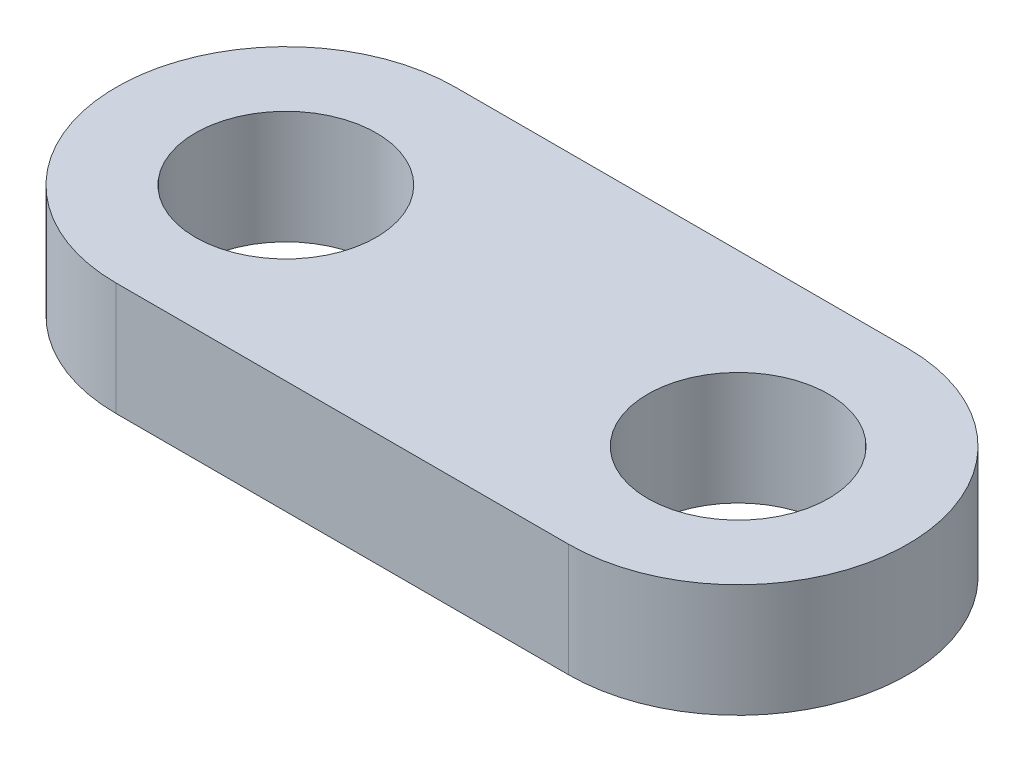
ISO-10303-21;
HEADER;
FILE_DESCRIPTION(('STEP AP214'),'2;1');
FILE_NAME('part.step','',(''),(''),'','','');
FILE_SCHEMA(('AUTOMOTIVE_DESIGN { 1 0 10303 214 1 1 1 1 }'));
ENDSEC;
DATA;
#1=APPLICATION_CONTEXT('core data for automotive mechanical design processes');
#2=APPLICATION_PROTOCOL_DEFINITION('international standard','automotive_design',2000,#1);
#3=PRODUCT_CONTEXT('',#1,'mechanical');
#4=PRODUCT('Part','Part','',(#3));
#5=PRODUCT_RELATED_PRODUCT_CATEGORY('part','',(#4));
#6=PRODUCT_DEFINITION_FORMATION('','',#4);
#7=PRODUCT_DEFINITION_CONTEXT('part definition',#1,'design');
#8=PRODUCT_DEFINITION('design','',#6,#7);
#9=PRODUCT_DEFINITION_SHAPE('','',#8);
#10=(LENGTH_UNIT() NAMED_UNIT(*) SI_UNIT(.MILLI.,.METRE.));
#11=(NAMED_UNIT(*) PLANE_ANGLE_UNIT() SI_UNIT($,.RADIAN.));
#12=(NAMED_UNIT(*) SI_UNIT($,.STERADIAN.) SOLID_ANGLE_UNIT());
#13=UNCERTAINTY_MEASURE_WITH_UNIT(LENGTH_MEASURE(1.E-05),#10,'distance_accuracy_value','');
#14=(GEOMETRIC_REPRESENTATION_CONTEXT(3) GLOBAL_UNCERTAINTY_ASSIGNED_CONTEXT((#13)) GLOBAL_UNIT_ASSIGNED_CONTEXT((#10,
#11,#12)) REPRESENTATION_CONTEXT('',''));
#15=CARTESIAN_POINT('',(0.,0.,0.));
#16=DIRECTION('',(0.,0.,1.));
#17=DIRECTION('',(1.,0.,0.));
#18=AXIS2_PLACEMENT_3D('',#15,#16,#17);
#19=CARTESIAN_POINT('',(10.,5.,0.));
#20=DIRECTION('',(0.,-1.,0.));
#21=DIRECTION('',(0.,0.,-1.));
#22=AXIS2_PLACEMENT_3D('',#19,#20,#21);
#23=PLANE('',#22);
#24=CARTESIAN_POINT('',(10.,5.,0.));
#25=DIRECTION('',(0.,1.,0.));
#26=DIRECTION('',(0.,0.,-1.));
#27=AXIS2_PLACEMENT_3D('',#24,#25,#26);
#28=CIRCLE('',#27,7.5);
#29=CARTESIAN_POINT('',(10.,5.,7.5));
#30=VERTEX_POINT('',#29);
#31=CARTESIAN_POINT('',(10.,5.,-7.5));
#32=VERTEX_POINT('',#31);
#33=EDGE_CURVE('E84',#30,#32,#28,.T.);
#34=ORIENTED_EDGE('',*,*,#33,.T.);
#35=DIRECTION('',(-1.,0.,0.));
#36=VECTOR('',#35,1.);
#37=CARTESIAN_POINT('',(-10.,5.,-7.5));
#38=LINE('',#37,#36);
#39=CARTESIAN_POINT('',(-10.,5.,-7.5));
#40=VERTEX_POINT('',#39);
#41=EDGE_CURVE('E79',#32,#40,#38,.T.);
#42=ORIENTED_EDGE('',*,*,#41,.T.);
#43=CARTESIAN_POINT('',(-10.,5.,0.));
#44=DIRECTION('',(0.,1.,0.));
#45=DIRECTION('',(0.,0.,1.));
#46=AXIS2_PLACEMENT_3D('',#43,#44,#45);
#47=CIRCLE('',#46,7.5);
#48=CARTESIAN_POINT('',(-10.,5.,7.5));
#49=VERTEX_POINT('',#48);
#50=EDGE_CURVE('E82',#40,#49,#47,.T.);
#51=ORIENTED_EDGE('',*,*,#50,.T.);
#52=DIRECTION('',(1.,0.,0.));
#53=VECTOR('',#52,1.);
#54=CARTESIAN_POINT('',(-10.,5.,7.5));
#55=LINE('',#54,#53);
#56=EDGE_CURVE('E49',#49,#30,#55,.T.);
#57=ORIENTED_EDGE('',*,*,#56,.T.);
#58=EDGE_LOOP('',(#34,#42,#51,#57));
#59=FACE_BOUND('',#58,.T.);
#60=CARTESIAN_POINT('',(-10.,5.,0.));
#61=DIRECTION('',(0.,1.,0.));
#62=DIRECTION('',(0.,0.,1.));
#63=AXIS2_PLACEMENT_3D('',#60,#61,#62);
#64=CIRCLE('',#63,4.);
#65=CARTESIAN_POINT('',(-10.,5.,4.));
#66=VERTEX_POINT('',#65);
#67=EDGE_CURVE('E99',#66,#66,#64,.T.);
#68=ORIENTED_EDGE('',*,*,#67,.F.);
#69=EDGE_LOOP('',(#68));
#70=FACE_BOUND('',#69,.T.);
#71=CARTESIAN_POINT('',(10.,5.,0.));
#72=DIRECTION('',(0.,1.,0.));
#73=DIRECTION('',(0.,0.,1.));
#74=AXIS2_PLACEMENT_3D('',#71,#72,#73);
#75=CIRCLE('',#74,4.);
#76=CARTESIAN_POINT('',(10.,5.,4.));
#77=VERTEX_POINT('',#76);
#78=EDGE_CURVE('E114',#77,#77,#75,.T.);
#79=ORIENTED_EDGE('',*,*,#78,.F.);
#80=EDGE_LOOP('',(#79));
#81=FACE_BOUND('',#80,.T.);
#82=ADVANCED_FACE('F32',(#59,#70,#81),#23,.F.);
#83=CARTESIAN_POINT('',(10.,0.,0.));
#84=DIRECTION('',(0.,-1.,0.));
#85=DIRECTION('',(0.,0.,-1.));
#86=AXIS2_PLACEMENT_3D('',#83,#84,#85);
#87=PLANE('',#86);
#88=CARTESIAN_POINT('',(-10.,0.,0.));
#89=DIRECTION('',(0.,1.,0.));
#90=DIRECTION('',(0.,0.,1.));
#91=AXIS2_PLACEMENT_3D('',#88,#89,#90);
#92=CIRCLE('',#91,4.);
#93=CARTESIAN_POINT('',(-10.,0.,4.));
#94=VERTEX_POINT('',#93);
#95=EDGE_CURVE('E111',#94,#94,#92,.T.);
#96=ORIENTED_EDGE('',*,*,#95,.T.);
#97=EDGE_LOOP('',(#96));
#98=FACE_BOUND('',#97,.T.);
#99=CARTESIAN_POINT('',(10.,0.,0.));
#100=DIRECTION('',(0.,1.,0.));
#101=DIRECTION('',(0.,0.,-1.));
#102=AXIS2_PLACEMENT_3D('',#99,#100,#101);
#103=CIRCLE('',#102,7.5);
#104=CARTESIAN_POINT('',(10.,0.,7.5));
#105=VERTEX_POINT('',#104);
#106=CARTESIAN_POINT('',(10.,0.,-7.5));
#107=VERTEX_POINT('',#106);
#108=EDGE_CURVE('E96',#105,#107,#103,.T.);
#109=ORIENTED_EDGE('',*,*,#108,.F.);
#110=DIRECTION('',(1.,0.,0.));
#111=VECTOR('',#110,1.);
#112=CARTESIAN_POINT('',(-10.,0.,7.5));
#113=LINE('',#112,#111);
#114=CARTESIAN_POINT('',(-10.,0.,7.5));
#115=VERTEX_POINT('',#114);
#116=EDGE_CURVE('E72',#115,#105,#113,.T.);
#117=ORIENTED_EDGE('',*,*,#116,.F.);
#118=CARTESIAN_POINT('',(-10.,0.,0.));
#119=DIRECTION('',(0.,1.,0.));
#120=DIRECTION('',(0.,0.,1.));
#121=AXIS2_PLACEMENT_3D('',#118,#119,#120);
#122=CIRCLE('',#121,7.5);
#123=CARTESIAN_POINT('',(-10.,0.,-7.5));
#124=VERTEX_POINT('',#123);
#125=EDGE_CURVE('E66',#124,#115,#122,.T.);
#126=ORIENTED_EDGE('',*,*,#125,.F.);
#127=DIRECTION('',(-1.,0.,0.));
#128=VECTOR('',#127,1.);
#129=CARTESIAN_POINT('',(-10.,0.,-7.5));
#130=LINE('',#129,#128);
#131=EDGE_CURVE('E88',#107,#124,#130,.T.);
#132=ORIENTED_EDGE('',*,*,#131,.F.);
#133=EDGE_LOOP('',(#109,#117,#126,#132));
#134=FACE_BOUND('',#133,.T.);
#135=CARTESIAN_POINT('',(10.,0.,0.));
#136=DIRECTION('',(0.,1.,0.));
#137=DIRECTION('',(0.,0.,1.));
#138=AXIS2_PLACEMENT_3D('',#135,#136,#137);
#139=CIRCLE('',#138,4.);
#140=CARTESIAN_POINT('',(10.,0.,4.));
#141=VERTEX_POINT('',#140);
#142=EDGE_CURVE('E117',#141,#141,#139,.T.);
#143=ORIENTED_EDGE('',*,*,#142,.T.);
#144=EDGE_LOOP('',(#143));
#145=FACE_BOUND('',#144,.T.);
#146=ADVANCED_FACE('F107',(#98,#134,#145),#87,.T.);
#147=CARTESIAN_POINT('',(10.,5.,0.));
#148=DIRECTION('',(0.,-1.,0.));
#149=DIRECTION('',(0.,0.,-1.));
#150=AXIS2_PLACEMENT_3D('',#147,#148,#149);
#151=CYLINDRICAL_SURFACE('',#150,7.5);
#152=ORIENTED_EDGE('',*,*,#108,.T.);
#153=DIRECTION('',(0.,-1.,0.));
#154=VECTOR('',#153,1.);
#155=CARTESIAN_POINT('',(10.,5.,-7.5));
#156=LINE('',#155,#154);
#157=EDGE_CURVE('E11',#32,#107,#156,.T.);
#158=ORIENTED_EDGE('',*,*,#157,.F.);
#159=ORIENTED_EDGE('',*,*,#33,.F.);
#160=DIRECTION('',(0.,-1.,0.));
#161=VECTOR('',#160,1.);
#162=CARTESIAN_POINT('',(10.,5.,7.5));
#163=LINE('',#162,#161);
#164=EDGE_CURVE('E92',#30,#105,#163,.T.);
#165=ORIENTED_EDGE('',*,*,#164,.T.);
#166=EDGE_LOOP('',(#152,#158,#159,#165));
#167=FACE_BOUND('',#166,.T.);
#168=ADVANCED_FACE('F34',(#167),#151,.T.);
#169=CARTESIAN_POINT('',(-10.,5.,-7.5));
#170=DIRECTION('',(0.,0.,1.));
#171=DIRECTION('',(1.,0.,0.));
#172=AXIS2_PLACEMENT_3D('',#169,#170,#171);
#173=PLANE('',#172);
#174=ORIENTED_EDGE('',*,*,#131,.T.);
#175=DIRECTION('',(0.,-1.,0.));
#176=VECTOR('',#175,1.);
#177=CARTESIAN_POINT('',(-10.,5.,-7.5));
#178=LINE('',#177,#176);
#179=EDGE_CURVE('E41',#40,#124,#178,.T.);
#180=ORIENTED_EDGE('',*,*,#179,.F.);
#181=ORIENTED_EDGE('',*,*,#41,.F.);
#182=ORIENTED_EDGE('',*,*,#157,.T.);
#183=EDGE_LOOP('',(#174,#180,#181,#182));
#184=FACE_BOUND('',#183,.T.);
#185=ADVANCED_FACE('F87',(#184),#173,.F.);
#186=CARTESIAN_POINT('',(-10.,5.,0.));
#187=DIRECTION('',(0.,-1.,0.));
#188=DIRECTION('',(0.,0.,-1.));
#189=AXIS2_PLACEMENT_3D('',#186,#187,#188);
#190=CYLINDRICAL_SURFACE('',#189,7.5);
#191=ORIENTED_EDGE('',*,*,#125,.T.);
#192=DIRECTION('',(0.,-1.,0.));
#193=VECTOR('',#192,1.);
#194=CARTESIAN_POINT('',(-10.,5.,7.5));
#195=LINE('',#194,#193);
#196=EDGE_CURVE('E89',#49,#115,#195,.T.);
#197=ORIENTED_EDGE('',*,*,#196,.F.);
#198=ORIENTED_EDGE('',*,*,#50,.F.);
#199=ORIENTED_EDGE('',*,*,#179,.T.);
#200=EDGE_LOOP('',(#191,#197,#198,#199));
#201=FACE_BOUND('',#200,.T.);
#202=ADVANCED_FACE('F90',(#201),#190,.T.);
#203=CARTESIAN_POINT('',(-10.,5.,7.5));
#204=DIRECTION('',(0.,0.,-1.));
#205=DIRECTION('',(-1.,0.,0.));
#206=AXIS2_PLACEMENT_3D('',#203,#204,#205);
#207=PLANE('',#206);
#208=ORIENTED_EDGE('',*,*,#116,.T.);
#209=ORIENTED_EDGE('',*,*,#164,.F.);
#210=ORIENTED_EDGE('',*,*,#56,.F.);
#211=ORIENTED_EDGE('',*,*,#196,.T.);
#212=EDGE_LOOP('',(#208,#209,#210,#211));
#213=FACE_BOUND('',#212,.T.);
#214=ADVANCED_FACE('F104',(#213),#207,.F.);
#215=CARTESIAN_POINT('',(-10.,5.,0.));
#216=DIRECTION('',(0.,-1.,0.));
#217=DIRECTION('',(0.,0.,-1.));
#218=AXIS2_PLACEMENT_3D('',#215,#216,#217);
#219=CYLINDRICAL_SURFACE('',#218,4.);
#220=ORIENTED_EDGE('',*,*,#67,.T.);
#221=EDGE_LOOP('',(#220));
#222=FACE_BOUND('',#221,.T.);
#223=ORIENTED_EDGE('',*,*,#95,.F.);
#224=EDGE_LOOP('',(#223));
#225=FACE_BOUND('',#224,.T.);
#226=ADVANCED_FACE('F134',(#222,#225),#219,.F.);
#227=CARTESIAN_POINT('',(10.,5.,0.));
#228=DIRECTION('',(0.,-1.,0.));
#229=DIRECTION('',(0.,0.,-1.));
#230=AXIS2_PLACEMENT_3D('',#227,#228,#229);
#231=CYLINDRICAL_SURFACE('',#230,4.);
#232=ORIENTED_EDGE('',*,*,#78,.T.);
#233=EDGE_LOOP('',(#232));
#234=FACE_BOUND('',#233,.T.);
#235=ORIENTED_EDGE('',*,*,#142,.F.);
#236=EDGE_LOOP('',(#235));
#237=FACE_BOUND('',#236,.T.);
#238=ADVANCED_FACE('F123',(#234,#237),#231,.F.);
#239=CLOSED_SHELL('',(#82,#146,#168,#185,#202,#214,#226,#238));
#240=MANIFOLD_SOLID_BREP('B2',#239);
#241=ADVANCED_BREP_SHAPE_REPRESENTATION('',(#18,#240),#14);
#242=SHAPE_DEFINITION_REPRESENTATION(#9,#241);
ENDSEC;
END-ISO-10303-21;
